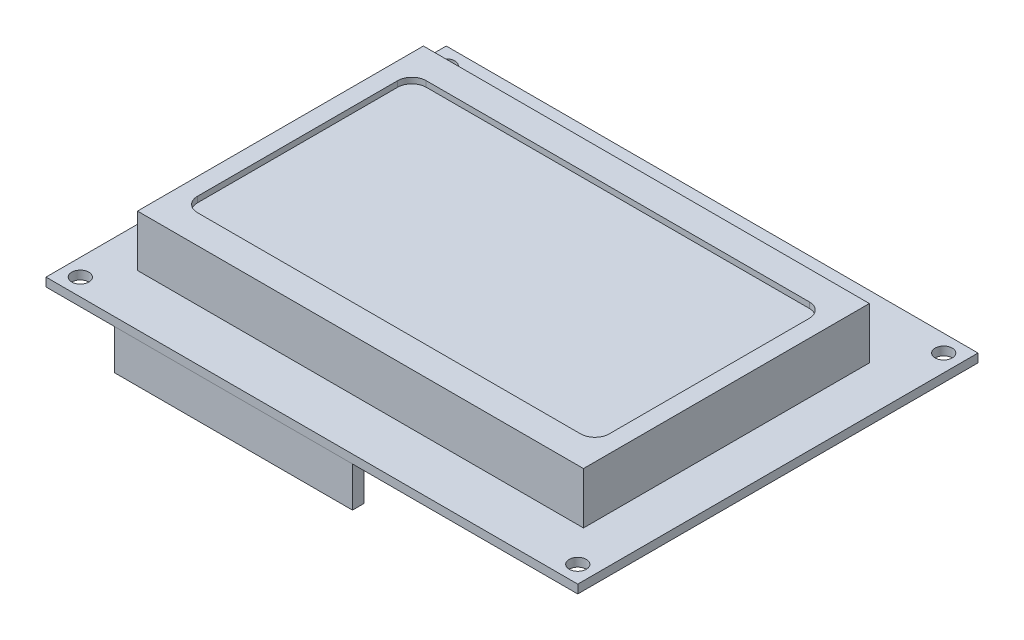
ISO-10303-21;
HEADER;
FILE_DESCRIPTION(('STEP AP214'),'2;1');
FILE_NAME('part.step','',(''),(''),'','','');
FILE_SCHEMA(('AUTOMOTIVE_DESIGN { 1 0 10303 214 1 1 1 1 }'));
ENDSEC;
DATA;
#1=APPLICATION_CONTEXT('core data for automotive mechanical design processes');
#2=APPLICATION_PROTOCOL_DEFINITION('international standard','automotive_design',2000,#1);
#3=PRODUCT_CONTEXT('',#1,'mechanical');
#4=PRODUCT('Part','Part','',(#3));
#5=PRODUCT_RELATED_PRODUCT_CATEGORY('part','',(#4));
#6=PRODUCT_DEFINITION_FORMATION('','',#4);
#7=PRODUCT_DEFINITION_CONTEXT('part definition',#1,'design');
#8=PRODUCT_DEFINITION('design','',#6,#7);
#9=PRODUCT_DEFINITION_SHAPE('','',#8);
#10=(LENGTH_UNIT() NAMED_UNIT(*) SI_UNIT(.MILLI.,.METRE.));
#11=(NAMED_UNIT(*) PLANE_ANGLE_UNIT() SI_UNIT($,.RADIAN.));
#12=(NAMED_UNIT(*) SI_UNIT($,.STERADIAN.) SOLID_ANGLE_UNIT());
#13=UNCERTAINTY_MEASURE_WITH_UNIT(LENGTH_MEASURE(1.E-05),#10,'distance_accuracy_value','');
#14=(GEOMETRIC_REPRESENTATION_CONTEXT(3) GLOBAL_UNCERTAINTY_ASSIGNED_CONTEXT((#13)) GLOBAL_UNIT_ASSIGNED_CONTEXT((#10,
#11,#12)) REPRESENTATION_CONTEXT('',''));
#15=CARTESIAN_POINT('',(0.,0.,0.));
#16=DIRECTION('',(0.,0.,1.));
#17=DIRECTION('',(1.,0.,0.));
#18=AXIS2_PLACEMENT_3D('',#15,#16,#17);
#19=CARTESIAN_POINT('',(12.,-7.,0.));
#20=DIRECTION('',(1.,0.,0.));
#21=DIRECTION('',(0.,0.,-1.));
#22=AXIS2_PLACEMENT_3D('',#19,#20,#21);
#23=PLANE('',#22);
#24=DIRECTION('',(0.,0.,-1.));
#25=VECTOR('',#24,1.);
#26=CARTESIAN_POINT('',(12.,0.,0.));
#27=LINE('',#26,#25);
#28=CARTESIAN_POINT('',(12.,0.,0.));
#29=VERTEX_POINT('',#28);
#30=CARTESIAN_POINT('',(12.,0.,-2.));
#31=VERTEX_POINT('',#30);
#32=EDGE_CURVE('E105',#29,#31,#27,.T.);
#33=ORIENTED_EDGE('',*,*,#32,.T.);
#34=DIRECTION('',(0.,1.,0.));
#35=VECTOR('',#34,1.);
#36=CARTESIAN_POINT('',(12.,-7.,-2.));
#37=LINE('',#36,#35);
#38=CARTESIAN_POINT('',(12.,-7.,-2.));
#39=VERTEX_POINT('',#38);
#40=EDGE_CURVE('E12',#39,#31,#37,.T.);
#41=ORIENTED_EDGE('',*,*,#40,.F.);
#42=DIRECTION('',(0.,0.,-1.));
#43=VECTOR('',#42,1.);
#44=CARTESIAN_POINT('',(12.,-7.,0.));
#45=LINE('',#44,#43);
#46=CARTESIAN_POINT('',(12.,-7.,0.));
#47=VERTEX_POINT('',#46);
#48=EDGE_CURVE('E93',#47,#39,#45,.T.);
#49=ORIENTED_EDGE('',*,*,#48,.F.);
#50=DIRECTION('',(0.,1.,0.));
#51=VECTOR('',#50,1.);
#52=CARTESIAN_POINT('',(12.,-7.,0.));
#53=LINE('',#52,#51);
#54=EDGE_CURVE('E101',#47,#29,#53,.T.);
#55=ORIENTED_EDGE('',*,*,#54,.T.);
#56=EDGE_LOOP('',(#33,#41,#49,#55));
#57=FACE_BOUND('',#56,.T.);
#58=ADVANCED_FACE('F42',(#57),#23,.F.);
#59=CARTESIAN_POINT('',(12.,-7.,-2.));
#60=DIRECTION('',(0.,0.,1.));
#61=DIRECTION('',(1.,0.,0.));
#62=AXIS2_PLACEMENT_3D('',#59,#60,#61);
#63=PLANE('',#62);
#64=DIRECTION('',(1.,0.,0.));
#65=VECTOR('',#64,1.);
#66=CARTESIAN_POINT('',(12.,0.,-2.));
#67=LINE('',#66,#65);
#68=CARTESIAN_POINT('',(53.6,0.,-2.));
#69=VERTEX_POINT('',#68);
#70=EDGE_CURVE('E97',#31,#69,#67,.T.);
#71=ORIENTED_EDGE('',*,*,#70,.T.);
#72=DIRECTION('',(0.,1.,0.));
#73=VECTOR('',#72,1.);
#74=CARTESIAN_POINT('',(53.6,-7.,-2.));
#75=LINE('',#74,#73);
#76=CARTESIAN_POINT('',(53.6,-7.,-2.));
#77=VERTEX_POINT('',#76);
#78=EDGE_CURVE('E50',#77,#69,#75,.T.);
#79=ORIENTED_EDGE('',*,*,#78,.F.);
#80=DIRECTION('',(1.,0.,0.));
#81=VECTOR('',#80,1.);
#82=CARTESIAN_POINT('',(12.,-7.,-2.));
#83=LINE('',#82,#81);
#84=EDGE_CURVE('E88',#39,#77,#83,.T.);
#85=ORIENTED_EDGE('',*,*,#84,.F.);
#86=ORIENTED_EDGE('',*,*,#40,.T.);
#87=EDGE_LOOP('',(#71,#79,#85,#86));
#88=FACE_BOUND('',#87,.T.);
#89=ADVANCED_FACE('F96',(#88),#63,.F.);
#90=CARTESIAN_POINT('',(53.6,-7.,0.));
#91=DIRECTION('',(-1.,0.,0.));
#92=DIRECTION('',(0.,0.,1.));
#93=AXIS2_PLACEMENT_3D('',#90,#91,#92);
#94=PLANE('',#93);
#95=DIRECTION('',(0.,0.,1.));
#96=VECTOR('',#95,1.);
#97=CARTESIAN_POINT('',(53.6,0.,0.));
#98=LINE('',#97,#96);
#99=CARTESIAN_POINT('',(53.6,0.,0.));
#100=VERTEX_POINT('',#99);
#101=EDGE_CURVE('E75',#69,#100,#98,.T.);
#102=ORIENTED_EDGE('',*,*,#101,.T.);
#103=DIRECTION('',(0.,1.,0.));
#104=VECTOR('',#103,1.);
#105=CARTESIAN_POINT('',(53.6,-7.,0.));
#106=LINE('',#105,#104);
#107=CARTESIAN_POINT('',(53.6,-7.,0.));
#108=VERTEX_POINT('',#107);
#109=EDGE_CURVE('E98',#108,#100,#106,.T.);
#110=ORIENTED_EDGE('',*,*,#109,.F.);
#111=DIRECTION('',(0.,0.,1.));
#112=VECTOR('',#111,1.);
#113=CARTESIAN_POINT('',(53.6,-7.,0.));
#114=LINE('',#113,#112);
#115=EDGE_CURVE('E91',#77,#108,#114,.T.);
#116=ORIENTED_EDGE('',*,*,#115,.F.);
#117=ORIENTED_EDGE('',*,*,#78,.T.);
#118=EDGE_LOOP('',(#102,#110,#116,#117));
#119=FACE_BOUND('',#118,.T.);
#120=ADVANCED_FACE('F99',(#119),#94,.F.);
#121=CARTESIAN_POINT('',(12.,-7.,0.));
#122=DIRECTION('',(0.,0.,-1.));
#123=DIRECTION('',(-1.,0.,0.));
#124=AXIS2_PLACEMENT_3D('',#121,#122,#123);
#125=PLANE('',#124);
#126=DIRECTION('',(-1.,0.,0.));
#127=VECTOR('',#126,1.);
#128=CARTESIAN_POINT('',(12.,0.,0.));
#129=LINE('',#128,#127);
#130=EDGE_CURVE('E81',#100,#29,#129,.T.);
#131=ORIENTED_EDGE('',*,*,#130,.T.);
#132=ORIENTED_EDGE('',*,*,#54,.F.);
#133=DIRECTION('',(-1.,0.,0.));
#134=VECTOR('',#133,1.);
#135=CARTESIAN_POINT('',(12.,-7.,0.));
#136=LINE('',#135,#134);
#137=EDGE_CURVE('E58',#108,#47,#136,.T.);
#138=ORIENTED_EDGE('',*,*,#137,.F.);
#139=ORIENTED_EDGE('',*,*,#109,.T.);
#140=EDGE_LOOP('',(#131,#132,#138,#139));
#141=FACE_BOUND('',#140,.T.);
#142=ADVANCED_FACE('F112',(#141),#125,.F.);
#143=CARTESIAN_POINT('',(12.,-7.,-2.));
#144=DIRECTION('',(0.,-1.,0.));
#145=DIRECTION('',(0.,0.,-1.));
#146=AXIS2_PLACEMENT_3D('',#143,#144,#145);
#147=PLANE('',#146);
#148=ORIENTED_EDGE('',*,*,#48,.T.);
#149=ORIENTED_EDGE('',*,*,#84,.T.);
#150=ORIENTED_EDGE('',*,*,#115,.T.);
#151=ORIENTED_EDGE('',*,*,#137,.T.);
#152=EDGE_LOOP('',(#148,#149,#150,#151));
#153=FACE_BOUND('',#152,.T.);
#154=ADVANCED_FACE('F89',(#153),#147,.T.);
#155=CARTESIAN_POINT('',(12.,0.,-2.));
#156=DIRECTION('',(0.,-1.,0.));
#157=DIRECTION('',(0.,0.,-1.));
#158=AXIS2_PLACEMENT_3D('',#155,#156,#157);
#159=PLANE('',#158);
#160=ORIENTED_EDGE('',*,*,#32,.F.);
#161=ORIENTED_EDGE('',*,*,#130,.F.);
#162=ORIENTED_EDGE('',*,*,#101,.F.);
#163=ORIENTED_EDGE('',*,*,#70,.F.);
#164=EDGE_LOOP('',(#160,#161,#162,#163));
#165=FACE_BOUND('',#164,.T.);
#166=ADVANCED_FACE('F115',(#165),#159,.F.);
#167=CLOSED_SHELL('',(#58,#89,#120,#142,#154,#166));
#168=MANIFOLD_SOLID_BREP('B2',#167);
#169=CARTESIAN_POINT('',(0.,1.5,-70.));
#170=DIRECTION('',(0.,-1.,0.));
#171=DIRECTION('',(0.,0.,-1.));
#172=AXIS2_PLACEMENT_3D('',#169,#170,#171);
#173=PLANE('',#172);
#174=CARTESIAN_POINT('',(3.,1.5,-3.));
#175=DIRECTION('',(0.,1.,0.));
#176=DIRECTION('',(0.,0.,1.));
#177=AXIS2_PLACEMENT_3D('',#174,#175,#176);
#178=CIRCLE('',#177,1.5);
#179=CARTESIAN_POINT('',(3.,1.5,-1.5));
#180=VERTEX_POINT('',#179);
#181=EDGE_CURVE('E675',#180,#180,#178,.T.);
#182=ORIENTED_EDGE('',*,*,#181,.F.);
#183=EDGE_LOOP('',(#182));
#184=FACE_BOUND('',#183,.T.);
#185=CARTESIAN_POINT('',(90.,1.5,-3.));
#186=DIRECTION('',(0.,1.,0.));
#187=DIRECTION('',(0.,0.,1.));
#188=AXIS2_PLACEMENT_3D('',#185,#186,#187);
#189=CIRCLE('',#188,1.5);
#190=CARTESIAN_POINT('',(90.,1.5,-1.5));
#191=VERTEX_POINT('',#190);
#192=EDGE_CURVE('E677',#191,#191,#189,.T.);
#193=ORIENTED_EDGE('',*,*,#192,.F.);
#194=EDGE_LOOP('',(#193));
#195=FACE_BOUND('',#194,.T.);
#196=CARTESIAN_POINT('',(90.,1.5,-67.));
#197=DIRECTION('',(0.,1.,0.));
#198=DIRECTION('',(0.,0.,1.));
#199=AXIS2_PLACEMENT_3D('',#196,#197,#198);
#200=CIRCLE('',#199,1.5);
#201=CARTESIAN_POINT('',(90.,1.5,-65.5));
#202=VERTEX_POINT('',#201);
#203=EDGE_CURVE('E683',#202,#202,#200,.T.);
#204=ORIENTED_EDGE('',*,*,#203,.F.);
#205=EDGE_LOOP('',(#204));
#206=FACE_BOUND('',#205,.T.);
#207=CARTESIAN_POINT('',(3.,1.5,-67.));
#208=DIRECTION('',(0.,1.,0.));
#209=DIRECTION('',(0.,0.,1.));
#210=AXIS2_PLACEMENT_3D('',#207,#208,#209);
#211=CIRCLE('',#210,1.5);
#212=CARTESIAN_POINT('',(3.,1.5,-65.5));
#213=VERTEX_POINT('',#212);
#214=EDGE_CURVE('E309',#213,#213,#211,.T.);
#215=ORIENTED_EDGE('',*,*,#214,.F.);
#216=EDGE_LOOP('',(#215));
#217=FACE_BOUND('',#216,.T.);
#218=DIRECTION('',(0.,0.,1.));
#219=VECTOR('',#218,1.);
#220=CARTESIAN_POINT('',(0.,1.5,0.));
#221=LINE('',#220,#219);
#222=CARTESIAN_POINT('',(0.,1.5,-70.));
#223=VERTEX_POINT('',#222);
#224=CARTESIAN_POINT('',(0.,1.5,0.));
#225=VERTEX_POINT('',#224);
#226=EDGE_CURVE('E387',#223,#225,#221,.T.);
#227=ORIENTED_EDGE('',*,*,#226,.T.);
#228=DIRECTION('',(1.,0.,0.));
#229=VECTOR('',#228,1.);
#230=CARTESIAN_POINT('',(0.,1.5,0.));
#231=LINE('',#230,#229);
#232=CARTESIAN_POINT('',(93.,1.5,0.));
#233=VERTEX_POINT('',#232);
#234=EDGE_CURVE('E390',#225,#233,#231,.T.);
#235=ORIENTED_EDGE('',*,*,#234,.T.);
#236=DIRECTION('',(0.,0.,-1.));
#237=VECTOR('',#236,1.);
#238=CARTESIAN_POINT('',(93.,1.5,0.));
#239=LINE('',#238,#237);
#240=CARTESIAN_POINT('',(93.,1.5,-70.));
#241=VERTEX_POINT('',#240);
#242=EDGE_CURVE('E393',#233,#241,#239,.T.);
#243=ORIENTED_EDGE('',*,*,#242,.T.);
#244=DIRECTION('',(-1.,0.,0.));
#245=VECTOR('',#244,1.);
#246=CARTESIAN_POINT('',(0.,1.5,-70.));
#247=LINE('',#246,#245);
#248=EDGE_CURVE('E395',#241,#223,#247,.T.);
#249=ORIENTED_EDGE('',*,*,#248,.T.);
#250=EDGE_LOOP('',(#227,#235,#243,#249));
#251=FACE_BOUND('',#250,.T.);
#252=DIRECTION('',(0.,0.,1.));
#253=VECTOR('',#252,1.);
#254=CARTESIAN_POINT('',(6.99999999999999,1.5,-9.));
#255=LINE('',#254,#253);
#256=CARTESIAN_POINT('',(6.99999999999999,1.5,-59.));
#257=VERTEX_POINT('',#256);
#258=CARTESIAN_POINT('',(6.99999999999999,1.5,-9.));
#259=VERTEX_POINT('',#258);
#260=EDGE_CURVE('E345',#257,#259,#255,.T.);
#261=ORIENTED_EDGE('',*,*,#260,.F.);
#262=DIRECTION('',(-1.,0.,0.));
#263=VECTOR('',#262,1.);
#264=CARTESIAN_POINT('',(6.99999999999999,1.5,-59.));
#265=LINE('',#264,#263);
#266=CARTESIAN_POINT('',(85.,1.5,-59.));
#267=VERTEX_POINT('',#266);
#268=EDGE_CURVE('E361',#267,#257,#265,.T.);
#269=ORIENTED_EDGE('',*,*,#268,.F.);
#270=DIRECTION('',(0.,0.,-1.));
#271=VECTOR('',#270,1.);
#272=CARTESIAN_POINT('',(85.,1.5,-9.));
#273=LINE('',#272,#271);
#274=CARTESIAN_POINT('',(85.,1.5,-9.));
#275=VERTEX_POINT('',#274);
#276=EDGE_CURVE('E371',#275,#267,#273,.T.);
#277=ORIENTED_EDGE('',*,*,#276,.F.);
#278=DIRECTION('',(1.,0.,0.));
#279=VECTOR('',#278,1.);
#280=CARTESIAN_POINT('',(6.99999999999999,1.5,-9.));
#281=LINE('',#280,#279);
#282=EDGE_CURVE('E192',#259,#275,#281,.T.);
#283=ORIENTED_EDGE('',*,*,#282,.F.);
#284=EDGE_LOOP('',(#261,#269,#277,#283));
#285=FACE_BOUND('',#284,.T.);
#286=ADVANCED_FACE('F169',(#184,#195,#206,#217,#251,#285),#173,.F.);
#287=CARTESIAN_POINT('',(0.,1.5,0.));
#288=DIRECTION('',(1.,0.,0.));
#289=DIRECTION('',(0.,0.,-1.));
#290=AXIS2_PLACEMENT_3D('',#287,#288,#289);
#291=PLANE('',#290);
#292=DIRECTION('',(0.,0.,1.));
#293=VECTOR('',#292,1.);
#294=CARTESIAN_POINT('',(0.,0.,0.));
#295=LINE('',#294,#293);
#296=CARTESIAN_POINT('',(0.,0.,-70.));
#297=VERTEX_POINT('',#296);
#298=CARTESIAN_POINT('',(0.,0.,0.));
#299=VERTEX_POINT('',#298);
#300=EDGE_CURVE('E386',#297,#299,#295,.T.);
#301=ORIENTED_EDGE('',*,*,#300,.T.);
#302=DIRECTION('',(0.,-1.,0.));
#303=VECTOR('',#302,1.);
#304=CARTESIAN_POINT('',(0.,1.5,0.));
#305=LINE('',#304,#303);
#306=EDGE_CURVE('E40',#225,#299,#305,.T.);
#307=ORIENTED_EDGE('',*,*,#306,.F.);
#308=ORIENTED_EDGE('',*,*,#226,.F.);
#309=DIRECTION('',(0.,-1.,0.));
#310=VECTOR('',#309,1.);
#311=CARTESIAN_POINT('',(0.,1.5,-70.));
#312=LINE('',#311,#310);
#313=EDGE_CURVE('E397',#223,#297,#312,.T.);
#314=ORIENTED_EDGE('',*,*,#313,.T.);
#315=EDGE_LOOP('',(#301,#307,#308,#314));
#316=FACE_BOUND('',#315,.T.);
#317=ADVANCED_FACE('F171',(#316),#291,.F.);
#318=CARTESIAN_POINT('',(0.,1.5,0.));
#319=DIRECTION('',(0.,0.,-1.));
#320=DIRECTION('',(-1.,0.,0.));
#321=AXIS2_PLACEMENT_3D('',#318,#319,#320);
#322=PLANE('',#321);
#323=DIRECTION('',(1.,0.,0.));
#324=VECTOR('',#323,1.);
#325=CARTESIAN_POINT('',(0.,0.,0.));
#326=LINE('',#325,#324);
#327=CARTESIAN_POINT('',(93.,0.,0.));
#328=VERTEX_POINT('',#327);
#329=EDGE_CURVE('E400',#299,#328,#326,.T.);
#330=ORIENTED_EDGE('',*,*,#329,.T.);
#331=DIRECTION('',(0.,-1.,0.));
#332=VECTOR('',#331,1.);
#333=CARTESIAN_POINT('',(93.,1.5,0.));
#334=LINE('',#333,#332);
#335=EDGE_CURVE('E177',#233,#328,#334,.T.);
#336=ORIENTED_EDGE('',*,*,#335,.F.);
#337=ORIENTED_EDGE('',*,*,#234,.F.);
#338=ORIENTED_EDGE('',*,*,#306,.T.);
#339=EDGE_LOOP('',(#330,#336,#337,#338));
#340=FACE_BOUND('',#339,.T.);
#341=ADVANCED_FACE('F429',(#340),#322,.F.);
#342=CARTESIAN_POINT('',(93.,1.5,0.));
#343=DIRECTION('',(-1.,0.,0.));
#344=DIRECTION('',(0.,0.,1.));
#345=AXIS2_PLACEMENT_3D('',#342,#343,#344);
#346=PLANE('',#345);
#347=DIRECTION('',(0.,0.,-1.));
#348=VECTOR('',#347,1.);
#349=CARTESIAN_POINT('',(93.,0.,0.));
#350=LINE('',#349,#348);
#351=CARTESIAN_POINT('',(93.,0.,-70.));
#352=VERTEX_POINT('',#351);
#353=EDGE_CURVE('E402',#328,#352,#350,.T.);
#354=ORIENTED_EDGE('',*,*,#353,.T.);
#355=DIRECTION('',(0.,-1.,0.));
#356=VECTOR('',#355,1.);
#357=CARTESIAN_POINT('',(93.,1.5,-70.));
#358=LINE('',#357,#356);
#359=EDGE_CURVE('E407',#241,#352,#358,.T.);
#360=ORIENTED_EDGE('',*,*,#359,.F.);
#361=ORIENTED_EDGE('',*,*,#242,.F.);
#362=ORIENTED_EDGE('',*,*,#335,.T.);
#363=EDGE_LOOP('',(#354,#360,#361,#362));
#364=FACE_BOUND('',#363,.T.);
#365=ADVANCED_FACE('F414',(#364),#346,.F.);
#366=CARTESIAN_POINT('',(0.,1.5,-70.));
#367=DIRECTION('',(0.,0.,1.));
#368=DIRECTION('',(1.,0.,0.));
#369=AXIS2_PLACEMENT_3D('',#366,#367,#368);
#370=PLANE('',#369);
#371=DIRECTION('',(-1.,0.,0.));
#372=VECTOR('',#371,1.);
#373=CARTESIAN_POINT('',(0.,0.,-70.));
#374=LINE('',#373,#372);
#375=EDGE_CURVE('E391',#352,#297,#374,.T.);
#376=ORIENTED_EDGE('',*,*,#375,.T.);
#377=ORIENTED_EDGE('',*,*,#313,.F.);
#378=ORIENTED_EDGE('',*,*,#248,.F.);
#379=ORIENTED_EDGE('',*,*,#359,.T.);
#380=EDGE_LOOP('',(#376,#377,#378,#379));
#381=FACE_BOUND('',#380,.T.);
#382=ADVANCED_FACE('F423',(#381),#370,.F.);
#383=CARTESIAN_POINT('',(0.,0.,-70.));
#384=DIRECTION('',(0.,-1.,0.));
#385=DIRECTION('',(0.,0.,-1.));
#386=AXIS2_PLACEMENT_3D('',#383,#384,#385);
#387=PLANE('',#386);
#388=CARTESIAN_POINT('',(3.,0.,-3.));
#389=DIRECTION('',(0.,1.,0.));
#390=DIRECTION('',(0.,0.,1.));
#391=AXIS2_PLACEMENT_3D('',#388,#389,#390);
#392=CIRCLE('',#391,1.5);
#393=CARTESIAN_POINT('',(3.,0.,-1.5));
#394=VERTEX_POINT('',#393);
#395=EDGE_CURVE('E673',#394,#394,#392,.T.);
#396=ORIENTED_EDGE('',*,*,#395,.T.);
#397=EDGE_LOOP('',(#396));
#398=FACE_BOUND('',#397,.T.);
#399=CARTESIAN_POINT('',(90.,0.,-3.));
#400=DIRECTION('',(0.,1.,0.));
#401=DIRECTION('',(0.,0.,1.));
#402=AXIS2_PLACEMENT_3D('',#399,#400,#401);
#403=CIRCLE('',#402,1.5);
#404=CARTESIAN_POINT('',(90.,0.,-1.5));
#405=VERTEX_POINT('',#404);
#406=EDGE_CURVE('E680',#405,#405,#403,.T.);
#407=ORIENTED_EDGE('',*,*,#406,.T.);
#408=EDGE_LOOP('',(#407));
#409=FACE_BOUND('',#408,.T.);
#410=CARTESIAN_POINT('',(90.,0.,-67.));
#411=DIRECTION('',(0.,1.,0.));
#412=DIRECTION('',(0.,0.,1.));
#413=AXIS2_PLACEMENT_3D('',#410,#411,#412);
#414=CIRCLE('',#413,1.5);
#415=CARTESIAN_POINT('',(90.,0.,-65.5));
#416=VERTEX_POINT('',#415);
#417=EDGE_CURVE('E686',#416,#416,#414,.T.);
#418=ORIENTED_EDGE('',*,*,#417,.T.);
#419=EDGE_LOOP('',(#418));
#420=FACE_BOUND('',#419,.T.);
#421=CARTESIAN_POINT('',(3.,0.,-67.));
#422=DIRECTION('',(0.,1.,0.));
#423=DIRECTION('',(0.,0.,1.));
#424=AXIS2_PLACEMENT_3D('',#421,#422,#423);
#425=CIRCLE('',#424,1.5);
#426=CARTESIAN_POINT('',(3.,0.,-65.5));
#427=VERTEX_POINT('',#426);
#428=EDGE_CURVE('E327',#427,#427,#425,.T.);
#429=ORIENTED_EDGE('',*,*,#428,.T.);
#430=EDGE_LOOP('',(#429));
#431=FACE_BOUND('',#430,.T.);
#432=ORIENTED_EDGE('',*,*,#300,.F.);
#433=ORIENTED_EDGE('',*,*,#375,.F.);
#434=ORIENTED_EDGE('',*,*,#353,.F.);
#435=ORIENTED_EDGE('',*,*,#329,.F.);
#436=EDGE_LOOP('',(#432,#433,#434,#435));
#437=FACE_BOUND('',#436,.T.);
#438=ADVANCED_FACE('F420',(#398,#409,#420,#431,#437),#387,.T.);
#439=CARTESIAN_POINT('',(6.99999999999999,10.5,-9.));
#440=DIRECTION('',(1.,0.,0.));
#441=DIRECTION('',(0.,0.,-1.));
#442=AXIS2_PLACEMENT_3D('',#439,#440,#441);
#443=PLANE('',#442);
#444=ORIENTED_EDGE('',*,*,#260,.T.);
#445=DIRECTION('',(0.,-1.,0.));
#446=VECTOR('',#445,1.);
#447=CARTESIAN_POINT('',(6.99999999999999,10.5,-9.));
#448=LINE('',#447,#446);
#449=CARTESIAN_POINT('',(6.99999999999999,10.5,-9.));
#450=VERTEX_POINT('',#449);
#451=EDGE_CURVE('E384',#450,#259,#448,.T.);
#452=ORIENTED_EDGE('',*,*,#451,.F.);
#453=DIRECTION('',(0.,0.,1.));
#454=VECTOR('',#453,1.);
#455=CARTESIAN_POINT('',(6.99999999999999,10.5,-9.));
#456=LINE('',#455,#454);
#457=CARTESIAN_POINT('',(6.99999999999999,10.5,-59.));
#458=VERTEX_POINT('',#457);
#459=EDGE_CURVE('E357',#458,#450,#456,.T.);
#460=ORIENTED_EDGE('',*,*,#459,.F.);
#461=DIRECTION('',(0.,-1.,0.));
#462=VECTOR('',#461,1.);
#463=CARTESIAN_POINT('',(6.99999999999999,10.5,-59.));
#464=LINE('',#463,#462);
#465=EDGE_CURVE('E367',#458,#257,#464,.T.);
#466=ORIENTED_EDGE('',*,*,#465,.T.);
#467=EDGE_LOOP('',(#444,#452,#460,#466));
#468=FACE_BOUND('',#467,.T.);
#469=ADVANCED_FACE('F445',(#468),#443,.F.);
#470=CARTESIAN_POINT('',(6.99999999999999,10.5,-9.));
#471=DIRECTION('',(0.,0.,-1.));
#472=DIRECTION('',(-1.,0.,0.));
#473=AXIS2_PLACEMENT_3D('',#470,#471,#472);
#474=PLANE('',#473);
#475=ORIENTED_EDGE('',*,*,#282,.T.);
#476=DIRECTION('',(0.,-1.,0.));
#477=VECTOR('',#476,1.);
#478=CARTESIAN_POINT('',(85.,10.5,-9.));
#479=LINE('',#478,#477);
#480=CARTESIAN_POINT('',(85.,10.5,-9.));
#481=VERTEX_POINT('',#480);
#482=EDGE_CURVE('E381',#481,#275,#479,.T.);
#483=ORIENTED_EDGE('',*,*,#482,.F.);
#484=DIRECTION('',(1.,0.,0.));
#485=VECTOR('',#484,1.);
#486=CARTESIAN_POINT('',(6.99999999999999,10.5,-9.));
#487=LINE('',#486,#485);
#488=EDGE_CURVE('E360',#450,#481,#487,.T.);
#489=ORIENTED_EDGE('',*,*,#488,.F.);
#490=ORIENTED_EDGE('',*,*,#451,.T.);
#491=EDGE_LOOP('',(#475,#483,#489,#490));
#492=FACE_BOUND('',#491,.T.);
#493=ADVANCED_FACE('F467',(#492),#474,.F.);
#494=CARTESIAN_POINT('',(85.,10.5,-9.));
#495=DIRECTION('',(-1.,0.,0.));
#496=DIRECTION('',(0.,0.,1.));
#497=AXIS2_PLACEMENT_3D('',#494,#495,#496);
#498=PLANE('',#497);
#499=ORIENTED_EDGE('',*,*,#276,.T.);
#500=DIRECTION('',(0.,-1.,0.));
#501=VECTOR('',#500,1.);
#502=CARTESIAN_POINT('',(85.,10.5,-59.));
#503=LINE('',#502,#501);
#504=CARTESIAN_POINT('',(85.,10.5,-59.));
#505=VERTEX_POINT('',#504);
#506=EDGE_CURVE('E378',#505,#267,#503,.T.);
#507=ORIENTED_EDGE('',*,*,#506,.F.);
#508=DIRECTION('',(0.,0.,-1.));
#509=VECTOR('',#508,1.);
#510=CARTESIAN_POINT('',(85.,10.5,-9.));
#511=LINE('',#510,#509);
#512=EDGE_CURVE('E363',#481,#505,#511,.T.);
#513=ORIENTED_EDGE('',*,*,#512,.F.);
#514=ORIENTED_EDGE('',*,*,#482,.T.);
#515=EDGE_LOOP('',(#499,#507,#513,#514));
#516=FACE_BOUND('',#515,.T.);
#517=ADVANCED_FACE('F475',(#516),#498,.F.);
#518=CARTESIAN_POINT('',(6.99999999999999,10.5,-59.));
#519=DIRECTION('',(0.,0.,1.));
#520=DIRECTION('',(1.,0.,0.));
#521=AXIS2_PLACEMENT_3D('',#518,#519,#520);
#522=PLANE('',#521);
#523=ORIENTED_EDGE('',*,*,#268,.T.);
#524=ORIENTED_EDGE('',*,*,#465,.F.);
#525=DIRECTION('',(-1.,0.,0.));
#526=VECTOR('',#525,1.);
#527=CARTESIAN_POINT('',(6.99999999999999,10.5,-59.));
#528=LINE('',#527,#526);
#529=EDGE_CURVE('E365',#505,#458,#528,.T.);
#530=ORIENTED_EDGE('',*,*,#529,.F.);
#531=ORIENTED_EDGE('',*,*,#506,.T.);
#532=EDGE_LOOP('',(#523,#524,#530,#531));
#533=FACE_BOUND('',#532,.T.);
#534=ADVANCED_FACE('F482',(#533),#522,.F.);
#535=CARTESIAN_POINT('',(6.99999999999999,10.5,-59.));
#536=DIRECTION('',(0.,-1.,0.));
#537=DIRECTION('',(0.,0.,-1.));
#538=AXIS2_PLACEMENT_3D('',#535,#536,#537);
#539=PLANE('',#538);
#540=DIRECTION('',(-1.,0.,0.));
#541=VECTOR('',#540,1.);
#542=CARTESIAN_POINT('',(12.5,10.5,-54.));
#543=LINE('',#542,#541);
#544=CARTESIAN_POINT('',(79.5,10.5,-54.));
#545=VERTEX_POINT('',#544);
#546=CARTESIAN_POINT('',(12.5,10.5,-54.));
#547=VERTEX_POINT('',#546);
#548=EDGE_CURVE('E326',#545,#547,#543,.T.);
#549=ORIENTED_EDGE('',*,*,#548,.F.);
#550=CARTESIAN_POINT('',(79.5,10.5,-51.5));
#551=DIRECTION('',(0.,1.,0.));
#552=DIRECTION('',(0.,0.,-1.));
#553=AXIS2_PLACEMENT_3D('',#550,#551,#552);
#554=CIRCLE('',#553,2.5);
#555=CARTESIAN_POINT('',(82.,10.5,-51.5));
#556=VERTEX_POINT('',#555);
#557=EDGE_CURVE('E184',#556,#545,#554,.T.);
#558=ORIENTED_EDGE('',*,*,#557,.F.);
#559=DIRECTION('',(0.,0.,-1.));
#560=VECTOR('',#559,1.);
#561=CARTESIAN_POINT('',(82.,10.5,-51.5));
#562=LINE('',#561,#560);
#563=CARTESIAN_POINT('',(82.,10.5,-16.5));
#564=VERTEX_POINT('',#563);
#565=EDGE_CURVE('E303',#564,#556,#562,.T.);
#566=ORIENTED_EDGE('',*,*,#565,.F.);
#567=CARTESIAN_POINT('',(79.5,10.5,-16.5));
#568=DIRECTION('',(0.,1.,0.));
#569=DIRECTION('',(0.,0.,-1.));
#570=AXIS2_PLACEMENT_3D('',#567,#568,#569);
#571=CIRCLE('',#570,2.5);
#572=CARTESIAN_POINT('',(79.5,10.5,-14.));
#573=VERTEX_POINT('',#572);
#574=EDGE_CURVE('E306',#573,#564,#571,.T.);
#575=ORIENTED_EDGE('',*,*,#574,.F.);
#576=DIRECTION('',(1.,0.,0.));
#577=VECTOR('',#576,1.);
#578=CARTESIAN_POINT('',(12.5,10.5,-14.));
#579=LINE('',#578,#577);
#580=CARTESIAN_POINT('',(12.5,10.5,-14.));
#581=VERTEX_POINT('',#580);
#582=EDGE_CURVE('E338',#581,#573,#579,.T.);
#583=ORIENTED_EDGE('',*,*,#582,.F.);
#584=CARTESIAN_POINT('',(12.5,10.5,-16.5));
#585=DIRECTION('',(0.,1.,0.));
#586=DIRECTION('',(0.,0.,-1.));
#587=AXIS2_PLACEMENT_3D('',#584,#585,#586);
#588=CIRCLE('',#587,2.5);
#589=CARTESIAN_POINT('',(10.,10.5,-16.5));
#590=VERTEX_POINT('',#589);
#591=EDGE_CURVE('E335',#590,#581,#588,.T.);
#592=ORIENTED_EDGE('',*,*,#591,.F.);
#593=DIRECTION('',(0.,0.,1.));
#594=VECTOR('',#593,1.);
#595=CARTESIAN_POINT('',(9.99999999999999,10.5,-51.5));
#596=LINE('',#595,#594);
#597=CARTESIAN_POINT('',(9.99999999999999,10.5,-51.5));
#598=VERTEX_POINT('',#597);
#599=EDGE_CURVE('E332',#598,#590,#596,.T.);
#600=ORIENTED_EDGE('',*,*,#599,.F.);
#601=CARTESIAN_POINT('',(12.5,10.5,-51.5));
#602=DIRECTION('',(0.,1.,0.));
#603=DIRECTION('',(0.,0.,-1.));
#604=AXIS2_PLACEMENT_3D('',#601,#602,#603);
#605=CIRCLE('',#604,2.5);
#606=EDGE_CURVE('E329',#547,#598,#605,.T.);
#607=ORIENTED_EDGE('',*,*,#606,.F.);
#608=EDGE_LOOP('',(#549,#558,#566,#575,#583,#592,#600,#607));
#609=FACE_BOUND('',#608,.T.);
#610=ORIENTED_EDGE('',*,*,#459,.T.);
#611=ORIENTED_EDGE('',*,*,#488,.T.);
#612=ORIENTED_EDGE('',*,*,#512,.T.);
#613=ORIENTED_EDGE('',*,*,#529,.T.);
#614=EDGE_LOOP('',(#610,#611,#612,#613));
#615=FACE_BOUND('',#614,.T.);
#616=ADVANCED_FACE('F489',(#609,#615),#539,.F.);
#617=CARTESIAN_POINT('',(79.5,9.5,-51.5));
#618=DIRECTION('',(0.,1.,0.));
#619=DIRECTION('',(0.,0.,1.));
#620=AXIS2_PLACEMENT_3D('',#617,#618,#619);
#621=CYLINDRICAL_SURFACE('',#620,2.5);
#622=ORIENTED_EDGE('',*,*,#557,.T.);
#623=DIRECTION('',(0.,1.,0.));
#624=VECTOR('',#623,1.);
#625=CARTESIAN_POINT('',(79.5,9.5,-54.));
#626=LINE('',#625,#624);
#627=CARTESIAN_POINT('',(79.5,9.5,-54.));
#628=VERTEX_POINT('',#627);
#629=EDGE_CURVE('E280',#628,#545,#626,.T.);
#630=ORIENTED_EDGE('',*,*,#629,.F.);
#631=CARTESIAN_POINT('',(79.5,9.5,-51.5));
#632=DIRECTION('',(0.,1.,0.));
#633=DIRECTION('',(0.,0.,-1.));
#634=AXIS2_PLACEMENT_3D('',#631,#632,#633);
#635=CIRCLE('',#634,2.5);
#636=CARTESIAN_POINT('',(82.,9.5,-51.5));
#637=VERTEX_POINT('',#636);
#638=EDGE_CURVE('E284',#637,#628,#635,.T.);
#639=ORIENTED_EDGE('',*,*,#638,.F.);
#640=DIRECTION('',(0.,1.,0.));
#641=VECTOR('',#640,1.);
#642=CARTESIAN_POINT('',(82.,9.5,-51.5));
#643=LINE('',#642,#641);
#644=EDGE_CURVE('E343',#637,#556,#643,.T.);
#645=ORIENTED_EDGE('',*,*,#644,.T.);
#646=EDGE_LOOP('',(#622,#630,#639,#645));
#647=FACE_BOUND('',#646,.T.);
#648=ADVANCED_FACE('F282',(#647),#621,.F.);
#649=CARTESIAN_POINT('',(82.,9.5,-51.5));
#650=DIRECTION('',(1.,0.,0.));
#651=DIRECTION('',(0.,0.,-1.));
#652=AXIS2_PLACEMENT_3D('',#649,#650,#651);
#653=PLANE('',#652);
#654=ORIENTED_EDGE('',*,*,#565,.T.);
#655=ORIENTED_EDGE('',*,*,#644,.F.);
#656=DIRECTION('',(0.,0.,-1.));
#657=VECTOR('',#656,1.);
#658=CARTESIAN_POINT('',(82.,9.5,-51.5));
#659=LINE('',#658,#657);
#660=CARTESIAN_POINT('',(82.,9.5,-16.5));
#661=VERTEX_POINT('',#660);
#662=EDGE_CURVE('E290',#661,#637,#659,.T.);
#663=ORIENTED_EDGE('',*,*,#662,.F.);
#664=DIRECTION('',(0.,1.,0.));
#665=VECTOR('',#664,1.);
#666=CARTESIAN_POINT('',(82.,9.5,-16.5));
#667=LINE('',#666,#665);
#668=EDGE_CURVE('E346',#661,#564,#667,.T.);
#669=ORIENTED_EDGE('',*,*,#668,.T.);
#670=EDGE_LOOP('',(#654,#655,#663,#669));
#671=FACE_BOUND('',#670,.T.);
#672=ADVANCED_FACE('F503',(#671),#653,.F.);
#673=CARTESIAN_POINT('',(79.5,9.5,-16.5));
#674=DIRECTION('',(0.,1.,0.));
#675=DIRECTION('',(0.,0.,1.));
#676=AXIS2_PLACEMENT_3D('',#673,#674,#675);
#677=CYLINDRICAL_SURFACE('',#676,2.5);
#678=ORIENTED_EDGE('',*,*,#574,.T.);
#679=ORIENTED_EDGE('',*,*,#668,.F.);
#680=CARTESIAN_POINT('',(79.5,9.5,-16.5));
#681=DIRECTION('',(0.,1.,0.));
#682=DIRECTION('',(0.,0.,-1.));
#683=AXIS2_PLACEMENT_3D('',#680,#681,#682);
#684=CIRCLE('',#683,2.5);
#685=CARTESIAN_POINT('',(79.5,9.5,-14.));
#686=VERTEX_POINT('',#685);
#687=EDGE_CURVE('E322',#686,#661,#684,.T.);
#688=ORIENTED_EDGE('',*,*,#687,.F.);
#689=DIRECTION('',(0.,1.,0.));
#690=VECTOR('',#689,1.);
#691=CARTESIAN_POINT('',(79.5,9.5,-14.));
#692=LINE('',#691,#690);
#693=EDGE_CURVE('E348',#686,#573,#692,.T.);
#694=ORIENTED_EDGE('',*,*,#693,.T.);
#695=EDGE_LOOP('',(#678,#679,#688,#694));
#696=FACE_BOUND('',#695,.T.);
#697=ADVANCED_FACE('F510',(#696),#677,.F.);
#698=CARTESIAN_POINT('',(12.5,9.5,-14.));
#699=DIRECTION('',(0.,0.,1.));
#700=DIRECTION('',(1.,0.,0.));
#701=AXIS2_PLACEMENT_3D('',#698,#699,#700);
#702=PLANE('',#701);
#703=ORIENTED_EDGE('',*,*,#582,.T.);
#704=ORIENTED_EDGE('',*,*,#693,.F.);
#705=DIRECTION('',(1.,0.,0.));
#706=VECTOR('',#705,1.);
#707=CARTESIAN_POINT('',(12.5,9.5,-14.));
#708=LINE('',#707,#706);
#709=CARTESIAN_POINT('',(12.5,9.5,-14.));
#710=VERTEX_POINT('',#709);
#711=EDGE_CURVE('E319',#710,#686,#708,.T.);
#712=ORIENTED_EDGE('',*,*,#711,.F.);
#713=DIRECTION('',(0.,1.,0.));
#714=VECTOR('',#713,1.);
#715=CARTESIAN_POINT('',(12.5,9.5,-14.));
#716=LINE('',#715,#714);
#717=EDGE_CURVE('E350',#710,#581,#716,.T.);
#718=ORIENTED_EDGE('',*,*,#717,.T.);
#719=EDGE_LOOP('',(#703,#704,#712,#718));
#720=FACE_BOUND('',#719,.T.);
#721=ADVANCED_FACE('F518',(#720),#702,.F.);
#722=CARTESIAN_POINT('',(12.5,9.5,-16.5));
#723=DIRECTION('',(0.,1.,0.));
#724=DIRECTION('',(0.,0.,1.));
#725=AXIS2_PLACEMENT_3D('',#722,#723,#724);
#726=CYLINDRICAL_SURFACE('',#725,2.5);
#727=ORIENTED_EDGE('',*,*,#591,.T.);
#728=ORIENTED_EDGE('',*,*,#717,.F.);
#729=CARTESIAN_POINT('',(12.5,9.5,-16.5));
#730=DIRECTION('',(0.,1.,0.));
#731=DIRECTION('',(0.,0.,-1.));
#732=AXIS2_PLACEMENT_3D('',#729,#730,#731);
#733=CIRCLE('',#732,2.5);
#734=CARTESIAN_POINT('',(10.,9.5,-16.5));
#735=VERTEX_POINT('',#734);
#736=EDGE_CURVE('E316',#735,#710,#733,.T.);
#737=ORIENTED_EDGE('',*,*,#736,.F.);
#738=DIRECTION('',(0.,1.,0.));
#739=VECTOR('',#738,1.);
#740=CARTESIAN_POINT('',(10.,9.5,-16.5));
#741=LINE('',#740,#739);
#742=EDGE_CURVE('E352',#735,#590,#741,.T.);
#743=ORIENTED_EDGE('',*,*,#742,.T.);
#744=EDGE_LOOP('',(#727,#728,#737,#743));
#745=FACE_BOUND('',#744,.T.);
#746=ADVANCED_FACE('F526',(#745),#726,.F.);
#747=CARTESIAN_POINT('',(9.99999999999999,9.5,-51.5));
#748=DIRECTION('',(-1.,0.,0.));
#749=DIRECTION('',(0.,0.,1.));
#750=AXIS2_PLACEMENT_3D('',#747,#748,#749);
#751=PLANE('',#750);
#752=ORIENTED_EDGE('',*,*,#599,.T.);
#753=ORIENTED_EDGE('',*,*,#742,.F.);
#754=DIRECTION('',(0.,0.,1.));
#755=VECTOR('',#754,1.);
#756=CARTESIAN_POINT('',(9.99999999999999,9.5,-51.5));
#757=LINE('',#756,#755);
#758=CARTESIAN_POINT('',(9.99999999999999,9.5,-51.5));
#759=VERTEX_POINT('',#758);
#760=EDGE_CURVE('E313',#759,#735,#757,.T.);
#761=ORIENTED_EDGE('',*,*,#760,.F.);
#762=DIRECTION('',(0.,1.,0.));
#763=VECTOR('',#762,1.);
#764=CARTESIAN_POINT('',(9.99999999999999,9.5,-51.5));
#765=LINE('',#764,#763);
#766=EDGE_CURVE('E354',#759,#598,#765,.T.);
#767=ORIENTED_EDGE('',*,*,#766,.T.);
#768=EDGE_LOOP('',(#752,#753,#761,#767));
#769=FACE_BOUND('',#768,.T.);
#770=ADVANCED_FACE('F534',(#769),#751,.F.);
#771=CARTESIAN_POINT('',(12.5,9.5,-51.5));
#772=DIRECTION('',(0.,1.,0.));
#773=DIRECTION('',(0.,0.,1.));
#774=AXIS2_PLACEMENT_3D('',#771,#772,#773);
#775=CYLINDRICAL_SURFACE('',#774,2.5);
#776=ORIENTED_EDGE('',*,*,#606,.T.);
#777=ORIENTED_EDGE('',*,*,#766,.F.);
#778=CARTESIAN_POINT('',(12.5,9.5,-51.5));
#779=DIRECTION('',(0.,1.,0.));
#780=DIRECTION('',(0.,0.,-1.));
#781=AXIS2_PLACEMENT_3D('',#778,#779,#780);
#782=CIRCLE('',#781,2.5);
#783=CARTESIAN_POINT('',(12.5,9.5,-54.));
#784=VERTEX_POINT('',#783);
#785=EDGE_CURVE('E298',#784,#759,#782,.T.);
#786=ORIENTED_EDGE('',*,*,#785,.F.);
#787=DIRECTION('',(0.,1.,0.));
#788=VECTOR('',#787,1.);
#789=CARTESIAN_POINT('',(12.5,9.5,-54.));
#790=LINE('',#789,#788);
#791=EDGE_CURVE('E289',#784,#547,#790,.T.);
#792=ORIENTED_EDGE('',*,*,#791,.T.);
#793=EDGE_LOOP('',(#776,#777,#786,#792));
#794=FACE_BOUND('',#793,.T.);
#795=ADVANCED_FACE('F542',(#794),#775,.F.);
#796=CARTESIAN_POINT('',(12.5,9.5,-54.));
#797=DIRECTION('',(0.,0.,-1.));
#798=DIRECTION('',(-1.,0.,0.));
#799=AXIS2_PLACEMENT_3D('',#796,#797,#798);
#800=PLANE('',#799);
#801=ORIENTED_EDGE('',*,*,#548,.T.);
#802=ORIENTED_EDGE('',*,*,#791,.F.);
#803=DIRECTION('',(-1.,0.,0.));
#804=VECTOR('',#803,1.);
#805=CARTESIAN_POINT('',(12.5,9.5,-54.));
#806=LINE('',#805,#804);
#807=EDGE_CURVE('E293',#628,#784,#806,.T.);
#808=ORIENTED_EDGE('',*,*,#807,.F.);
#809=ORIENTED_EDGE('',*,*,#629,.T.);
#810=EDGE_LOOP('',(#801,#802,#808,#809));
#811=FACE_BOUND('',#810,.T.);
#812=ADVANCED_FACE('F294',(#811),#800,.F.);
#813=CARTESIAN_POINT('',(79.5,9.5,-51.5));
#814=DIRECTION('',(0.,-1.,0.));
#815=DIRECTION('',(0.,0.,-1.));
#816=AXIS2_PLACEMENT_3D('',#813,#814,#815);
#817=PLANE('',#816);
#818=ORIENTED_EDGE('',*,*,#638,.T.);
#819=ORIENTED_EDGE('',*,*,#807,.T.);
#820=ORIENTED_EDGE('',*,*,#785,.T.);
#821=ORIENTED_EDGE('',*,*,#760,.T.);
#822=ORIENTED_EDGE('',*,*,#736,.T.);
#823=ORIENTED_EDGE('',*,*,#711,.T.);
#824=ORIENTED_EDGE('',*,*,#687,.T.);
#825=ORIENTED_EDGE('',*,*,#662,.T.);
#826=EDGE_LOOP('',(#818,#819,#820,#821,#822,#823,#824,#825));
#827=FACE_BOUND('',#826,.T.);
#828=ADVANCED_FACE('F300',(#827),#817,.F.);
#829=CARTESIAN_POINT('',(3.,0.,-67.));
#830=DIRECTION('',(0.,1.,0.));
#831=DIRECTION('',(0.,0.,1.));
#832=AXIS2_PLACEMENT_3D('',#829,#830,#831);
#833=CYLINDRICAL_SURFACE('',#832,1.5);
#834=ORIENTED_EDGE('',*,*,#428,.F.);
#835=EDGE_LOOP('',(#834));
#836=FACE_BOUND('',#835,.T.);
#837=ORIENTED_EDGE('',*,*,#214,.T.);
#838=EDGE_LOOP('',(#837));
#839=FACE_BOUND('',#838,.T.);
#840=ADVANCED_FACE('F563',(#836,#839),#833,.F.);
#841=CARTESIAN_POINT('',(90.,0.,-67.));
#842=DIRECTION('',(0.,1.,0.));
#843=DIRECTION('',(0.,0.,1.));
#844=AXIS2_PLACEMENT_3D('',#841,#842,#843);
#845=CYLINDRICAL_SURFACE('',#844,1.5);
#846=ORIENTED_EDGE('',*,*,#417,.F.);
#847=EDGE_LOOP('',(#846));
#848=FACE_BOUND('',#847,.T.);
#849=ORIENTED_EDGE('',*,*,#203,.T.);
#850=EDGE_LOOP('',(#849));
#851=FACE_BOUND('',#850,.T.);
#852=ADVANCED_FACE('F569',(#848,#851),#845,.F.);
#853=CARTESIAN_POINT('',(90.,0.,-3.));
#854=DIRECTION('',(0.,1.,0.));
#855=DIRECTION('',(0.,0.,1.));
#856=AXIS2_PLACEMENT_3D('',#853,#854,#855);
#857=CYLINDRICAL_SURFACE('',#856,1.5);
#858=ORIENTED_EDGE('',*,*,#406,.F.);
#859=EDGE_LOOP('',(#858));
#860=FACE_BOUND('',#859,.T.);
#861=ORIENTED_EDGE('',*,*,#192,.T.);
#862=EDGE_LOOP('',(#861));
#863=FACE_BOUND('',#862,.T.);
#864=ADVANCED_FACE('F577',(#860,#863),#857,.F.);
#865=CARTESIAN_POINT('',(3.,0.,-3.));
#866=DIRECTION('',(0.,1.,0.));
#867=DIRECTION('',(0.,0.,1.));
#868=AXIS2_PLACEMENT_3D('',#865,#866,#867);
#869=CYLINDRICAL_SURFACE('',#868,1.5);
#870=ORIENTED_EDGE('',*,*,#395,.F.);
#871=EDGE_LOOP('',(#870));
#872=FACE_BOUND('',#871,.T.);
#873=ORIENTED_EDGE('',*,*,#181,.T.);
#874=EDGE_LOOP('',(#873));
#875=FACE_BOUND('',#874,.T.);
#876=ADVANCED_FACE('F585',(#872,#875),#869,.F.);
#877=CLOSED_SHELL('',(#286,#317,#341,#365,#382,#438,#469,#493,#517,#534,#616,#648,#672,#697,
#721,#746,#770,#795,#812,#828,#840,#852,#864,#876));
#878=MANIFOLD_SOLID_BREP('B6',#877);
#879=ADVANCED_BREP_SHAPE_REPRESENTATION('',(#18,#168,#878),#14);
#880=SHAPE_DEFINITION_REPRESENTATION(#9,#879);
ENDSEC;
END-ISO-10303-21;
